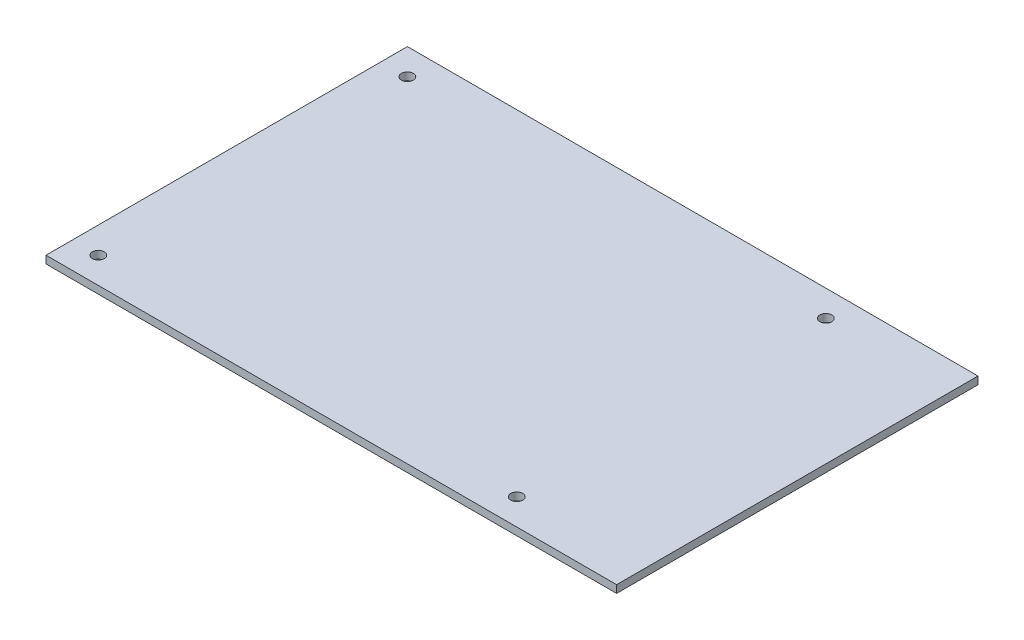
ISO-10303-21;
HEADER;
FILE_DESCRIPTION(('STEP AP214'),'2;1');
FILE_NAME('part.step','',(''),(''),'','','');
FILE_SCHEMA(('AUTOMOTIVE_DESIGN { 1 0 10303 214 1 1 1 1 }'));
ENDSEC;
DATA;
#1=APPLICATION_CONTEXT('core data for automotive mechanical design processes');
#2=APPLICATION_PROTOCOL_DEFINITION('international standard','automotive_design',2000,#1);
#3=PRODUCT_CONTEXT('',#1,'mechanical');
#4=PRODUCT('Part','Part','',(#3));
#5=PRODUCT_RELATED_PRODUCT_CATEGORY('part','',(#4));
#6=PRODUCT_DEFINITION_FORMATION('','',#4);
#7=PRODUCT_DEFINITION_CONTEXT('part definition',#1,'design');
#8=PRODUCT_DEFINITION('design','',#6,#7);
#9=PRODUCT_DEFINITION_SHAPE('','',#8);
#10=(LENGTH_UNIT() NAMED_UNIT(*) SI_UNIT(.MILLI.,.METRE.));
#11=(NAMED_UNIT(*) PLANE_ANGLE_UNIT() SI_UNIT($,.RADIAN.));
#12=(NAMED_UNIT(*) SI_UNIT($,.STERADIAN.) SOLID_ANGLE_UNIT());
#13=UNCERTAINTY_MEASURE_WITH_UNIT(LENGTH_MEASURE(1.E-05),#10,'distance_accuracy_value','');
#14=(GEOMETRIC_REPRESENTATION_CONTEXT(3) GLOBAL_UNCERTAINTY_ASSIGNED_CONTEXT((#13)) GLOBAL_UNIT_ASSIGNED_CONTEXT((#10,
#11,#12)) REPRESENTATION_CONTEXT('',''));
#15=CARTESIAN_POINT('',(0.,0.,0.));
#16=DIRECTION('',(0.,0.,1.));
#17=DIRECTION('',(1.,0.,0.));
#18=AXIS2_PLACEMENT_3D('',#15,#16,#17);
#19=CARTESIAN_POINT('',(-60.,-1.6,38.));
#20=DIRECTION('',(-1.,0.,0.));
#21=DIRECTION('',(0.,0.,1.));
#22=AXIS2_PLACEMENT_3D('',#19,#20,#21);
#23=PLANE('',#22);
#24=DIRECTION('',(0.,0.,1.));
#25=VECTOR('',#24,1.);
#26=CARTESIAN_POINT('',(-60.,0.,38.));
#27=LINE('',#26,#25);
#28=CARTESIAN_POINT('',(-60.,0.,-38.));
#29=VERTEX_POINT('',#28);
#30=CARTESIAN_POINT('',(-60.,0.,38.));
#31=VERTEX_POINT('',#30);
#32=EDGE_CURVE('E98',#29,#31,#27,.T.);
#33=ORIENTED_EDGE('',*,*,#32,.F.);
#34=DIRECTION('',(0.,1.,0.));
#35=VECTOR('',#34,1.);
#36=CARTESIAN_POINT('',(-60.,-1.6,-38.));
#37=LINE('',#36,#35);
#38=CARTESIAN_POINT('',(-60.,-1.6,-38.));
#39=VERTEX_POINT('',#38);
#40=EDGE_CURVE('E11',#39,#29,#37,.T.);
#41=ORIENTED_EDGE('',*,*,#40,.F.);
#42=DIRECTION('',(0.,0.,1.));
#43=VECTOR('',#42,1.);
#44=CARTESIAN_POINT('',(-60.,-1.6,38.));
#45=LINE('',#44,#43);
#46=CARTESIAN_POINT('',(-60.,-1.6,38.));
#47=VERTEX_POINT('',#46);
#48=EDGE_CURVE('E91',#39,#47,#45,.T.);
#49=ORIENTED_EDGE('',*,*,#48,.T.);
#50=DIRECTION('',(0.,1.,0.));
#51=VECTOR('',#50,1.);
#52=CARTESIAN_POINT('',(-60.,-1.6,38.));
#53=LINE('',#52,#51);
#54=EDGE_CURVE('E36',#47,#31,#53,.T.);
#55=ORIENTED_EDGE('',*,*,#54,.T.);
#56=EDGE_LOOP('',(#33,#41,#49,#55));
#57=FACE_BOUND('',#56,.T.);
#58=ADVANCED_FACE('F33',(#57),#23,.T.);
#59=CARTESIAN_POINT('',(60.,-1.6,-38.));
#60=DIRECTION('',(0.,0.,-1.));
#61=DIRECTION('',(-1.,0.,0.));
#62=AXIS2_PLACEMENT_3D('',#59,#60,#61);
#63=PLANE('',#62);
#64=DIRECTION('',(-1.,0.,0.));
#65=VECTOR('',#64,1.);
#66=CARTESIAN_POINT('',(60.,0.,-38.));
#67=LINE('',#66,#65);
#68=CARTESIAN_POINT('',(60.,0.,-38.));
#69=VERTEX_POINT('',#68);
#70=EDGE_CURVE('E93',#69,#29,#67,.T.);
#71=ORIENTED_EDGE('',*,*,#70,.F.);
#72=DIRECTION('',(0.,1.,0.));
#73=VECTOR('',#72,1.);
#74=CARTESIAN_POINT('',(60.,-1.6,-38.));
#75=LINE('',#74,#73);
#76=CARTESIAN_POINT('',(60.,-1.6,-38.));
#77=VERTEX_POINT('',#76);
#78=EDGE_CURVE('E42',#77,#69,#75,.T.);
#79=ORIENTED_EDGE('',*,*,#78,.F.);
#80=DIRECTION('',(-1.,0.,0.));
#81=VECTOR('',#80,1.);
#82=CARTESIAN_POINT('',(60.,-1.6,-38.));
#83=LINE('',#82,#81);
#84=EDGE_CURVE('E88',#77,#39,#83,.T.);
#85=ORIENTED_EDGE('',*,*,#84,.T.);
#86=ORIENTED_EDGE('',*,*,#40,.T.);
#87=EDGE_LOOP('',(#71,#79,#85,#86));
#88=FACE_BOUND('',#87,.T.);
#89=ADVANCED_FACE('F109',(#88),#63,.T.);
#90=CARTESIAN_POINT('',(60.,-1.6,38.));
#91=DIRECTION('',(1.,0.,0.));
#92=DIRECTION('',(0.,0.,-1.));
#93=AXIS2_PLACEMENT_3D('',#90,#91,#92);
#94=PLANE('',#93);
#95=DIRECTION('',(0.,0.,-1.));
#96=VECTOR('',#95,1.);
#97=CARTESIAN_POINT('',(60.,0.,38.));
#98=LINE('',#97,#96);
#99=CARTESIAN_POINT('',(60.,0.,38.));
#100=VERTEX_POINT('',#99);
#101=EDGE_CURVE('E83',#100,#69,#98,.T.);
#102=ORIENTED_EDGE('',*,*,#101,.F.);
#103=DIRECTION('',(0.,1.,0.));
#104=VECTOR('',#103,1.);
#105=CARTESIAN_POINT('',(60.,-1.6,38.));
#106=LINE('',#105,#104);
#107=CARTESIAN_POINT('',(60.,-1.6,38.));
#108=VERTEX_POINT('',#107);
#109=EDGE_CURVE('E78',#108,#100,#106,.T.);
#110=ORIENTED_EDGE('',*,*,#109,.F.);
#111=DIRECTION('',(0.,0.,-1.));
#112=VECTOR('',#111,1.);
#113=CARTESIAN_POINT('',(60.,-1.6,38.));
#114=LINE('',#113,#112);
#115=EDGE_CURVE('E81',#108,#77,#114,.T.);
#116=ORIENTED_EDGE('',*,*,#115,.T.);
#117=ORIENTED_EDGE('',*,*,#78,.T.);
#118=EDGE_LOOP('',(#102,#110,#116,#117));
#119=FACE_BOUND('',#118,.T.);
#120=ADVANCED_FACE('F80',(#119),#94,.T.);
#121=CARTESIAN_POINT('',(60.,-1.6,38.));
#122=DIRECTION('',(0.,0.,1.));
#123=DIRECTION('',(1.,0.,0.));
#124=AXIS2_PLACEMENT_3D('',#121,#122,#123);
#125=PLANE('',#124);
#126=DIRECTION('',(1.,0.,0.));
#127=VECTOR('',#126,1.);
#128=CARTESIAN_POINT('',(60.,0.,38.));
#129=LINE('',#128,#127);
#130=EDGE_CURVE('E101',#31,#100,#129,.T.);
#131=ORIENTED_EDGE('',*,*,#130,.F.);
#132=ORIENTED_EDGE('',*,*,#54,.F.);
#133=DIRECTION('',(1.,0.,0.));
#134=VECTOR('',#133,1.);
#135=CARTESIAN_POINT('',(60.,-1.6,38.));
#136=LINE('',#135,#134);
#137=EDGE_CURVE('E87',#47,#108,#136,.T.);
#138=ORIENTED_EDGE('',*,*,#137,.T.);
#139=ORIENTED_EDGE('',*,*,#109,.T.);
#140=EDGE_LOOP('',(#131,#132,#138,#139));
#141=FACE_BOUND('',#140,.T.);
#142=ADVANCED_FACE('F90',(#141),#125,.T.);
#143=CARTESIAN_POINT('',(0.,-1.6,0.));
#144=DIRECTION('',(0.,1.,0.));
#145=DIRECTION('',(0.,0.,1.));
#146=AXIS2_PLACEMENT_3D('',#143,#144,#145);
#147=PLANE('',#146);
#148=CARTESIAN_POINT('',(33.5,-1.6,32.5));
#149=DIRECTION('',(0.,1.,0.));
#150=DIRECTION('',(0.,0.,1.));
#151=AXIS2_PLACEMENT_3D('',#148,#149,#150);
#152=CIRCLE('',#151,1.25);
#153=CARTESIAN_POINT('',(33.5,-1.6,33.75));
#154=VERTEX_POINT('',#153);
#155=EDGE_CURVE('E150',#154,#154,#152,.T.);
#156=ORIENTED_EDGE('',*,*,#155,.T.);
#157=EDGE_LOOP('',(#156));
#158=FACE_BOUND('',#157,.T.);
#159=CARTESIAN_POINT('',(33.5,-1.6,-32.5));
#160=DIRECTION('',(0.,1.,0.));
#161=DIRECTION('',(0.,0.,1.));
#162=AXIS2_PLACEMENT_3D('',#159,#160,#161);
#163=CIRCLE('',#162,1.25);
#164=CARTESIAN_POINT('',(33.5,-1.6,-31.25));
#165=VERTEX_POINT('',#164);
#166=EDGE_CURVE('E158',#165,#165,#163,.T.);
#167=ORIENTED_EDGE('',*,*,#166,.T.);
#168=EDGE_LOOP('',(#167));
#169=FACE_BOUND('',#168,.T.);
#170=CARTESIAN_POINT('',(-54.5,-1.6,32.5));
#171=DIRECTION('',(0.,1.,0.));
#172=DIRECTION('',(0.,0.,1.));
#173=AXIS2_PLACEMENT_3D('',#170,#171,#172);
#174=CIRCLE('',#173,1.25);
#175=CARTESIAN_POINT('',(-54.5,-1.6,33.75));
#176=VERTEX_POINT('',#175);
#177=EDGE_CURVE('E164',#176,#176,#174,.T.);
#178=ORIENTED_EDGE('',*,*,#177,.T.);
#179=EDGE_LOOP('',(#178));
#180=FACE_BOUND('',#179,.T.);
#181=CARTESIAN_POINT('',(-54.5,-1.6,-32.5));
#182=DIRECTION('',(0.,1.,0.));
#183=DIRECTION('',(0.,0.,1.));
#184=AXIS2_PLACEMENT_3D('',#181,#182,#183);
#185=CIRCLE('',#184,1.25);
#186=CARTESIAN_POINT('',(-54.5,-1.6,-31.25));
#187=VERTEX_POINT('',#186);
#188=EDGE_CURVE('E102',#187,#187,#185,.T.);
#189=ORIENTED_EDGE('',*,*,#188,.T.);
#190=EDGE_LOOP('',(#189));
#191=FACE_BOUND('',#190,.T.);
#192=ORIENTED_EDGE('',*,*,#48,.F.);
#193=ORIENTED_EDGE('',*,*,#84,.F.);
#194=ORIENTED_EDGE('',*,*,#115,.F.);
#195=ORIENTED_EDGE('',*,*,#137,.F.);
#196=EDGE_LOOP('',(#192,#193,#194,#195));
#197=FACE_BOUND('',#196,.T.);
#198=ADVANCED_FACE('F86',(#158,#169,#180,#191,#197),#147,.F.);
#199=CARTESIAN_POINT('',(0.,0.,0.));
#200=DIRECTION('',(0.,1.,0.));
#201=DIRECTION('',(0.,0.,1.));
#202=AXIS2_PLACEMENT_3D('',#199,#200,#201);
#203=PLANE('',#202);
#204=CARTESIAN_POINT('',(33.5,0.,32.5));
#205=DIRECTION('',(0.,1.,0.));
#206=DIRECTION('',(0.,0.,1.));
#207=AXIS2_PLACEMENT_3D('',#204,#205,#206);
#208=CIRCLE('',#207,1.25);
#209=CARTESIAN_POINT('',(33.5,0.,33.75));
#210=VERTEX_POINT('',#209);
#211=EDGE_CURVE('E153',#210,#210,#208,.T.);
#212=ORIENTED_EDGE('',*,*,#211,.F.);
#213=EDGE_LOOP('',(#212));
#214=FACE_BOUND('',#213,.T.);
#215=CARTESIAN_POINT('',(33.5,0.,-32.5));
#216=DIRECTION('',(0.,1.,0.));
#217=DIRECTION('',(0.,0.,1.));
#218=AXIS2_PLACEMENT_3D('',#215,#216,#217);
#219=CIRCLE('',#218,1.25);
#220=CARTESIAN_POINT('',(33.5,0.,-31.25));
#221=VERTEX_POINT('',#220);
#222=EDGE_CURVE('E155',#221,#221,#219,.T.);
#223=ORIENTED_EDGE('',*,*,#222,.F.);
#224=EDGE_LOOP('',(#223));
#225=FACE_BOUND('',#224,.T.);
#226=CARTESIAN_POINT('',(-54.5,0.,32.5));
#227=DIRECTION('',(0.,1.,0.));
#228=DIRECTION('',(0.,0.,1.));
#229=AXIS2_PLACEMENT_3D('',#226,#227,#228);
#230=CIRCLE('',#229,1.25);
#231=CARTESIAN_POINT('',(-54.5,0.,33.75));
#232=VERTEX_POINT('',#231);
#233=EDGE_CURVE('E161',#232,#232,#230,.T.);
#234=ORIENTED_EDGE('',*,*,#233,.F.);
#235=EDGE_LOOP('',(#234));
#236=FACE_BOUND('',#235,.T.);
#237=CARTESIAN_POINT('',(-54.5,0.,-32.5));
#238=DIRECTION('',(0.,1.,0.));
#239=DIRECTION('',(0.,0.,1.));
#240=AXIS2_PLACEMENT_3D('',#237,#238,#239);
#241=CIRCLE('',#240,1.25);
#242=CARTESIAN_POINT('',(-54.5,0.,-31.25));
#243=VERTEX_POINT('',#242);
#244=EDGE_CURVE('E167',#243,#243,#241,.T.);
#245=ORIENTED_EDGE('',*,*,#244,.F.);
#246=EDGE_LOOP('',(#245));
#247=FACE_BOUND('',#246,.T.);
#248=ORIENTED_EDGE('',*,*,#32,.T.);
#249=ORIENTED_EDGE('',*,*,#130,.T.);
#250=ORIENTED_EDGE('',*,*,#101,.T.);
#251=ORIENTED_EDGE('',*,*,#70,.T.);
#252=EDGE_LOOP('',(#248,#249,#250,#251));
#253=FACE_BOUND('',#252,.T.);
#254=ADVANCED_FACE('F108',(#214,#225,#236,#247,#253),#203,.T.);
#255=CARTESIAN_POINT('',(-54.5,-1.6,-32.5));
#256=DIRECTION('',(0.,1.,0.));
#257=DIRECTION('',(0.,0.,1.));
#258=AXIS2_PLACEMENT_3D('',#255,#256,#257);
#259=CYLINDRICAL_SURFACE('',#258,1.25);
#260=ORIENTED_EDGE('',*,*,#188,.F.);
#261=EDGE_LOOP('',(#260));
#262=FACE_BOUND('',#261,.T.);
#263=ORIENTED_EDGE('',*,*,#244,.T.);
#264=EDGE_LOOP('',(#263));
#265=FACE_BOUND('',#264,.T.);
#266=ADVANCED_FACE('F127',(#262,#265),#259,.F.);
#267=CARTESIAN_POINT('',(-54.5,-1.6,32.5));
#268=DIRECTION('',(0.,1.,0.));
#269=DIRECTION('',(0.,0.,1.));
#270=AXIS2_PLACEMENT_3D('',#267,#268,#269);
#271=CYLINDRICAL_SURFACE('',#270,1.25);
#272=ORIENTED_EDGE('',*,*,#177,.F.);
#273=EDGE_LOOP('',(#272));
#274=FACE_BOUND('',#273,.T.);
#275=ORIENTED_EDGE('',*,*,#233,.T.);
#276=EDGE_LOOP('',(#275));
#277=FACE_BOUND('',#276,.T.);
#278=ADVANCED_FACE('F134',(#274,#277),#271,.F.);
#279=CARTESIAN_POINT('',(33.5,-1.6,-32.5));
#280=DIRECTION('',(0.,1.,0.));
#281=DIRECTION('',(0.,0.,1.));
#282=AXIS2_PLACEMENT_3D('',#279,#280,#281);
#283=CYLINDRICAL_SURFACE('',#282,1.25);
#284=ORIENTED_EDGE('',*,*,#166,.F.);
#285=EDGE_LOOP('',(#284));
#286=FACE_BOUND('',#285,.T.);
#287=ORIENTED_EDGE('',*,*,#222,.T.);
#288=EDGE_LOOP('',(#287));
#289=FACE_BOUND('',#288,.T.);
#290=ADVANCED_FACE('F138',(#286,#289),#283,.F.);
#291=CARTESIAN_POINT('',(33.5,-1.6,32.5));
#292=DIRECTION('',(0.,1.,0.));
#293=DIRECTION('',(0.,0.,1.));
#294=AXIS2_PLACEMENT_3D('',#291,#292,#293);
#295=CYLINDRICAL_SURFACE('',#294,1.25);
#296=ORIENTED_EDGE('',*,*,#155,.F.);
#297=EDGE_LOOP('',(#296));
#298=FACE_BOUND('',#297,.T.);
#299=ORIENTED_EDGE('',*,*,#211,.T.);
#300=EDGE_LOOP('',(#299));
#301=FACE_BOUND('',#300,.T.);
#302=ADVANCED_FACE('F142',(#298,#301),#295,.F.);
#303=CLOSED_SHELL('',(#58,#89,#120,#142,#198,#254,#266,#278,#290,#302));
#304=MANIFOLD_SOLID_BREP('B2',#303);
#305=ADVANCED_BREP_SHAPE_REPRESENTATION('',(#18,#304),#14);
#306=SHAPE_DEFINITION_REPRESENTATION(#9,#305);
ENDSEC;
END-ISO-10303-21;
